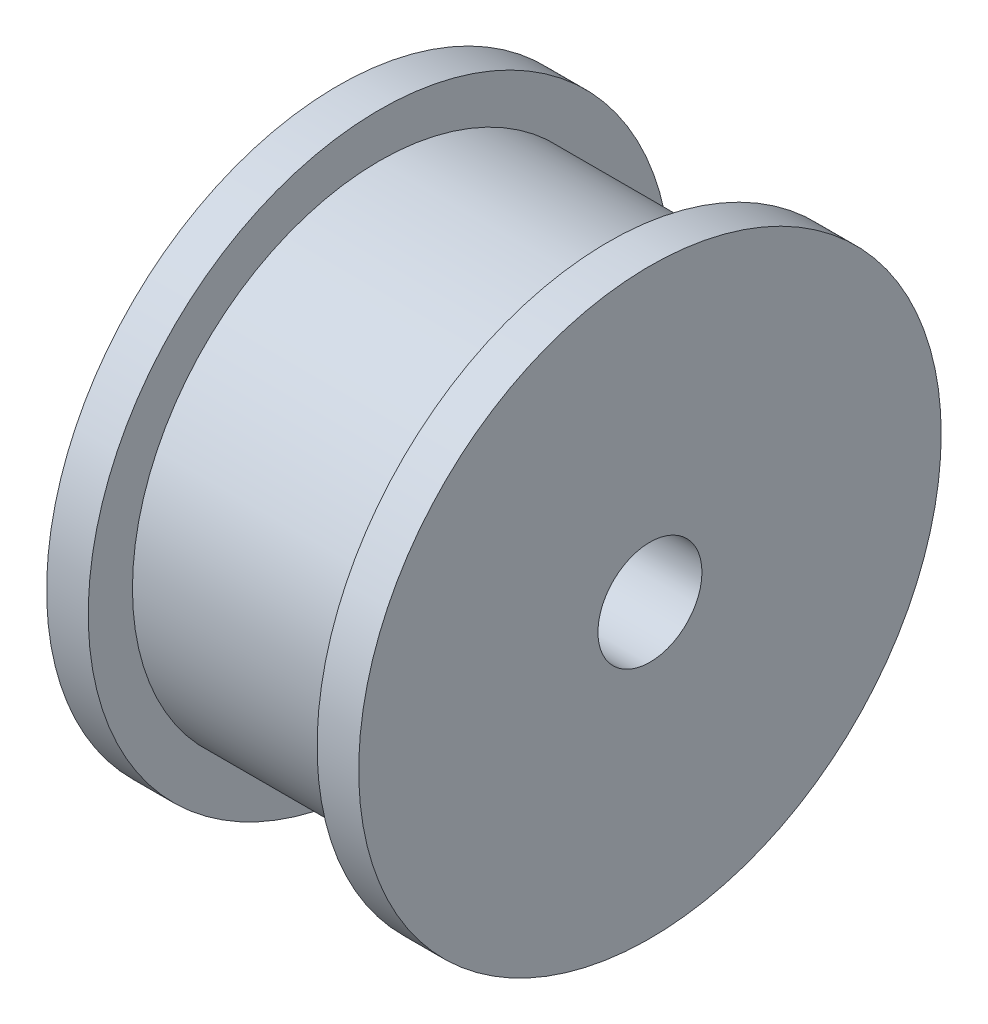
ISO-10303-21;
HEADER;
FILE_DESCRIPTION(('STEP AP214'),'2;1');
FILE_NAME('part.step','',(''),(''),'','','');
FILE_SCHEMA(('AUTOMOTIVE_DESIGN { 1 0 10303 214 1 1 1 1 }'));
ENDSEC;
DATA;
#1=APPLICATION_CONTEXT('core data for automotive mechanical design processes');
#2=APPLICATION_PROTOCOL_DEFINITION('international standard','automotive_design',2000,#1);
#3=PRODUCT_CONTEXT('',#1,'mechanical');
#4=PRODUCT('Part','Part','',(#3));
#5=PRODUCT_RELATED_PRODUCT_CATEGORY('part','',(#4));
#6=PRODUCT_DEFINITION_FORMATION('','',#4);
#7=PRODUCT_DEFINITION_CONTEXT('part definition',#1,'design');
#8=PRODUCT_DEFINITION('design','',#6,#7);
#9=PRODUCT_DEFINITION_SHAPE('','',#8);
#10=(LENGTH_UNIT() NAMED_UNIT(*) SI_UNIT(.MILLI.,.METRE.));
#11=(NAMED_UNIT(*) PLANE_ANGLE_UNIT() SI_UNIT($,.RADIAN.));
#12=(NAMED_UNIT(*) SI_UNIT($,.STERADIAN.) SOLID_ANGLE_UNIT());
#13=UNCERTAINTY_MEASURE_WITH_UNIT(LENGTH_MEASURE(1.E-05),#10,'distance_accuracy_value','');
#14=(GEOMETRIC_REPRESENTATION_CONTEXT(3) GLOBAL_UNCERTAINTY_ASSIGNED_CONTEXT((#13)) GLOBAL_UNIT_ASSIGNED_CONTEXT((#10,
#11,#12)) REPRESENTATION_CONTEXT('',''));
#15=CARTESIAN_POINT('',(0.,0.,0.));
#16=DIRECTION('',(0.,0.,1.));
#17=DIRECTION('',(1.,0.,0.));
#18=AXIS2_PLACEMENT_3D('',#15,#16,#17);
#19=CARTESIAN_POINT('',(2.,0.,0.));
#20=DIRECTION('',(-1.,0.,0.));
#21=DIRECTION('',(0.,0.,1.));
#22=AXIS2_PLACEMENT_3D('',#19,#20,#21);
#23=CYLINDRICAL_SURFACE('',#22,14.);
#24=CARTESIAN_POINT('',(2.,0.,0.));
#25=DIRECTION('',(1.,0.,0.));
#26=DIRECTION('',(0.,0.,-1.));
#27=AXIS2_PLACEMENT_3D('',#24,#25,#26);
#28=CIRCLE('',#27,14.);
#29=CARTESIAN_POINT('',(2.,0.,-14.));
#30=VERTEX_POINT('',#29);
#31=EDGE_CURVE('E10',#30,#30,#28,.T.);
#32=ORIENTED_EDGE('',*,*,#31,.F.);
#33=EDGE_LOOP('',(#32));
#34=FACE_BOUND('',#33,.T.);
#35=CARTESIAN_POINT('',(0.,0.,0.));
#36=DIRECTION('',(1.,0.,0.));
#37=DIRECTION('',(0.,0.,-1.));
#38=AXIS2_PLACEMENT_3D('',#35,#36,#37);
#39=CIRCLE('',#38,14.);
#40=CARTESIAN_POINT('',(0.,0.,-14.));
#41=VERTEX_POINT('',#40);
#42=EDGE_CURVE('E33',#41,#41,#39,.T.);
#43=ORIENTED_EDGE('',*,*,#42,.T.);
#44=EDGE_LOOP('',(#43));
#45=FACE_BOUND('',#44,.T.);
#46=ADVANCED_FACE('F30',(#34,#45),#23,.T.);
#47=CARTESIAN_POINT('',(2.,0.,0.));
#48=DIRECTION('',(1.,0.,0.));
#49=DIRECTION('',(0.,0.,-1.));
#50=AXIS2_PLACEMENT_3D('',#47,#48,#49);
#51=PLANE('',#50);
#52=CARTESIAN_POINT('',(2.,0.,0.));
#53=DIRECTION('',(1.,0.,0.));
#54=DIRECTION('',(0.,0.,-1.));
#55=AXIS2_PLACEMENT_3D('',#52,#53,#54);
#56=CIRCLE('',#55,11.875);
#57=CARTESIAN_POINT('',(2.,0.,-11.875));
#58=VERTEX_POINT('',#57);
#59=EDGE_CURVE('E42',#58,#58,#56,.T.);
#60=ORIENTED_EDGE('',*,*,#59,.F.);
#61=EDGE_LOOP('',(#60));
#62=FACE_BOUND('',#61,.T.);
#63=ORIENTED_EDGE('',*,*,#31,.T.);
#64=EDGE_LOOP('',(#63));
#65=FACE_BOUND('',#64,.T.);
#66=ADVANCED_FACE('F89',(#62,#65),#51,.T.);
#67=CARTESIAN_POINT('',(0.,0.,0.));
#68=DIRECTION('',(1.,0.,0.));
#69=DIRECTION('',(0.,0.,-1.));
#70=AXIS2_PLACEMENT_3D('',#67,#68,#69);
#71=PLANE('',#70);
#72=CARTESIAN_POINT('',(0.,0.,0.));
#73=DIRECTION('',(1.,0.,0.));
#74=DIRECTION('',(0.,0.,-1.));
#75=AXIS2_PLACEMENT_3D('',#72,#73,#74);
#76=CIRCLE('',#75,2.5);
#77=CARTESIAN_POINT('',(0.,0.,-2.5));
#78=VERTEX_POINT('',#77);
#79=EDGE_CURVE('E51',#78,#78,#76,.T.);
#80=ORIENTED_EDGE('',*,*,#79,.T.);
#81=EDGE_LOOP('',(#80));
#82=FACE_BOUND('',#81,.T.);
#83=ORIENTED_EDGE('',*,*,#42,.F.);
#84=EDGE_LOOP('',(#83));
#85=FACE_BOUND('',#84,.T.);
#86=ADVANCED_FACE('F60',(#82,#85),#71,.F.);
#87=CARTESIAN_POINT('',(13.,0.,0.));
#88=DIRECTION('',(-1.,0.,0.));
#89=DIRECTION('',(0.,0.,1.));
#90=AXIS2_PLACEMENT_3D('',#87,#88,#89);
#91=CYLINDRICAL_SURFACE('',#90,11.875);
#92=CARTESIAN_POINT('',(13.,0.,0.));
#93=DIRECTION('',(1.,0.,0.));
#94=DIRECTION('',(0.,0.,-1.));
#95=AXIS2_PLACEMENT_3D('',#92,#93,#94);
#96=CIRCLE('',#95,11.875);
#97=CARTESIAN_POINT('',(13.,0.,-11.875));
#98=VERTEX_POINT('',#97);
#99=EDGE_CURVE('E40',#98,#98,#96,.T.);
#100=ORIENTED_EDGE('',*,*,#99,.F.);
#101=EDGE_LOOP('',(#100));
#102=FACE_BOUND('',#101,.T.);
#103=ORIENTED_EDGE('',*,*,#59,.T.);
#104=EDGE_LOOP('',(#103));
#105=FACE_BOUND('',#104,.T.);
#106=ADVANCED_FACE('F79',(#102,#105),#91,.T.);
#107=CARTESIAN_POINT('',(15.,0.,0.));
#108=DIRECTION('',(-1.,0.,0.));
#109=DIRECTION('',(0.,0.,1.));
#110=AXIS2_PLACEMENT_3D('',#107,#108,#109);
#111=CYLINDRICAL_SURFACE('',#110,14.);
#112=CARTESIAN_POINT('',(15.,0.,0.));
#113=DIRECTION('',(1.,0.,0.));
#114=DIRECTION('',(0.,0.,-1.));
#115=AXIS2_PLACEMENT_3D('',#112,#113,#114);
#116=CIRCLE('',#115,14.);
#117=CARTESIAN_POINT('',(15.,0.,-14.));
#118=VERTEX_POINT('',#117);
#119=EDGE_CURVE('E45',#118,#118,#116,.T.);
#120=ORIENTED_EDGE('',*,*,#119,.F.);
#121=EDGE_LOOP('',(#120));
#122=FACE_BOUND('',#121,.T.);
#123=CARTESIAN_POINT('',(13.,0.,0.));
#124=DIRECTION('',(1.,0.,0.));
#125=DIRECTION('',(0.,0.,-1.));
#126=AXIS2_PLACEMENT_3D('',#123,#124,#125);
#127=CIRCLE('',#126,14.);
#128=CARTESIAN_POINT('',(13.,0.,-14.));
#129=VERTEX_POINT('',#128);
#130=EDGE_CURVE('E48',#129,#129,#127,.T.);
#131=ORIENTED_EDGE('',*,*,#130,.T.);
#132=EDGE_LOOP('',(#131));
#133=FACE_BOUND('',#132,.T.);
#134=ADVANCED_FACE('F73',(#122,#133),#111,.T.);
#135=CARTESIAN_POINT('',(15.,0.,0.));
#136=DIRECTION('',(1.,0.,0.));
#137=DIRECTION('',(0.,0.,-1.));
#138=AXIS2_PLACEMENT_3D('',#135,#136,#137);
#139=PLANE('',#138);
#140=CARTESIAN_POINT('',(15.,0.,0.));
#141=DIRECTION('',(1.,0.,0.));
#142=DIRECTION('',(0.,0.,-1.));
#143=AXIS2_PLACEMENT_3D('',#140,#141,#142);
#144=CIRCLE('',#143,2.5);
#145=CARTESIAN_POINT('',(15.,0.,-2.5));
#146=VERTEX_POINT('',#145);
#147=EDGE_CURVE('E54',#146,#146,#144,.T.);
#148=ORIENTED_EDGE('',*,*,#147,.F.);
#149=EDGE_LOOP('',(#148));
#150=FACE_BOUND('',#149,.T.);
#151=ORIENTED_EDGE('',*,*,#119,.T.);
#152=EDGE_LOOP('',(#151));
#153=FACE_BOUND('',#152,.T.);
#154=ADVANCED_FACE('F70',(#150,#153),#139,.T.);
#155=CARTESIAN_POINT('',(13.,0.,0.));
#156=DIRECTION('',(1.,0.,0.));
#157=DIRECTION('',(0.,0.,-1.));
#158=AXIS2_PLACEMENT_3D('',#155,#156,#157);
#159=PLANE('',#158);
#160=ORIENTED_EDGE('',*,*,#99,.T.);
#161=EDGE_LOOP('',(#160));
#162=FACE_BOUND('',#161,.T.);
#163=ORIENTED_EDGE('',*,*,#130,.F.);
#164=EDGE_LOOP('',(#163));
#165=FACE_BOUND('',#164,.T.);
#166=ADVANCED_FACE('F66',(#162,#165),#159,.F.);
#167=CARTESIAN_POINT('',(0.,0.,0.));
#168=DIRECTION('',(1.,0.,0.));
#169=DIRECTION('',(0.,0.,-1.));
#170=AXIS2_PLACEMENT_3D('',#167,#168,#169);
#171=CYLINDRICAL_SURFACE('',#170,2.5);
#172=ORIENTED_EDGE('',*,*,#79,.F.);
#173=EDGE_LOOP('',(#172));
#174=FACE_BOUND('',#173,.T.);
#175=ORIENTED_EDGE('',*,*,#147,.T.);
#176=EDGE_LOOP('',(#175));
#177=FACE_BOUND('',#176,.T.);
#178=ADVANCED_FACE('F63',(#174,#177),#171,.F.);
#179=CLOSED_SHELL('',(#46,#66,#86,#106,#134,#154,#166,#178));
#180=MANIFOLD_SOLID_BREP('B2',#179);
#181=ADVANCED_BREP_SHAPE_REPRESENTATION('',(#18,#180),#14);
#182=SHAPE_DEFINITION_REPRESENTATION(#9,#181);
ENDSEC;
END-ISO-10303-21;
